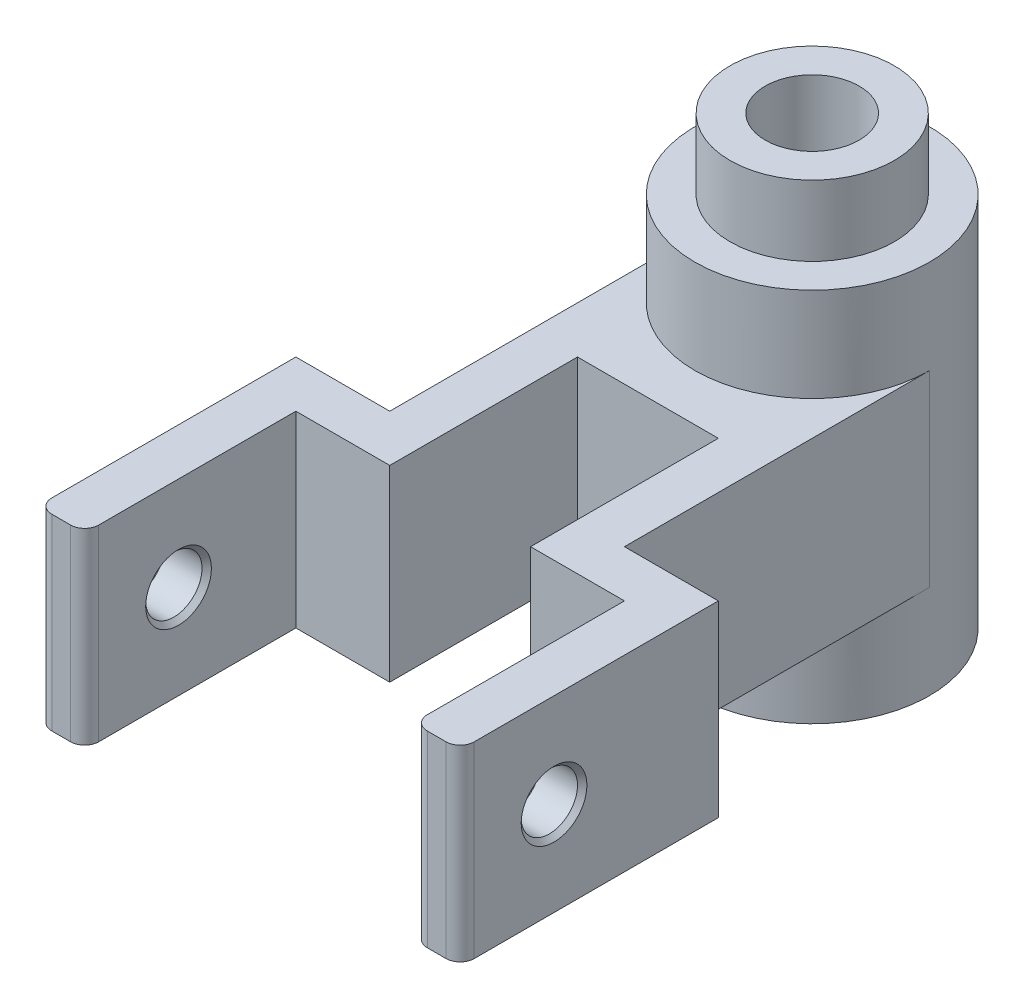
ISO-10303-21;
HEADER;
FILE_DESCRIPTION(('STEP AP214'),'2;1');
FILE_NAME('part.step','',(''),(''),'','','');
FILE_SCHEMA(('AUTOMOTIVE_DESIGN { 1 0 10303 214 1 1 1 1 }'));
ENDSEC;
DATA;
#1=APPLICATION_CONTEXT('core data for automotive mechanical design processes');
#2=APPLICATION_PROTOCOL_DEFINITION('international standard','automotive_design',2000,#1);
#3=PRODUCT_CONTEXT('',#1,'mechanical');
#4=PRODUCT('Part','Part','',(#3));
#5=PRODUCT_RELATED_PRODUCT_CATEGORY('part','',(#4));
#6=PRODUCT_DEFINITION_FORMATION('','',#4);
#7=PRODUCT_DEFINITION_CONTEXT('part definition',#1,'design');
#8=PRODUCT_DEFINITION('design','',#6,#7);
#9=PRODUCT_DEFINITION_SHAPE('','',#8);
#10=(LENGTH_UNIT() NAMED_UNIT(*) SI_UNIT(.MILLI.,.METRE.));
#11=(NAMED_UNIT(*) PLANE_ANGLE_UNIT() SI_UNIT($,.RADIAN.));
#12=(NAMED_UNIT(*) SI_UNIT($,.STERADIAN.) SOLID_ANGLE_UNIT());
#13=UNCERTAINTY_MEASURE_WITH_UNIT(LENGTH_MEASURE(1.E-05),#10,'distance_accuracy_value','');
#14=(GEOMETRIC_REPRESENTATION_CONTEXT(3) GLOBAL_UNCERTAINTY_ASSIGNED_CONTEXT((#13)) GLOBAL_UNIT_ASSIGNED_CONTEXT((#10,
#11,#12)) REPRESENTATION_CONTEXT('',''));
#15=CARTESIAN_POINT('',(0.,0.,0.));
#16=DIRECTION('',(0.,0.,1.));
#17=DIRECTION('',(1.,0.,0.));
#18=AXIS2_PLACEMENT_3D('',#15,#16,#17);
#19=CARTESIAN_POINT('',(35.,40.,-120.));
#20=DIRECTION('',(0.,1.,0.));
#21=DIRECTION('',(0.,0.,1.));
#22=AXIS2_PLACEMENT_3D('',#19,#20,#21);
#23=PLANE('',#22);
#24=CARTESIAN_POINT('',(35.,40.,-120.));
#25=DIRECTION('',(0.,1.,0.));
#26=DIRECTION('',(0.,0.,1.));
#27=AXIS2_PLACEMENT_3D('',#24,#25,#26);
#28=CIRCLE('',#27,25.);
#29=CARTESIAN_POINT('',(35.,40.,-95.));
#30=VERTEX_POINT('',#29);
#31=EDGE_CURVE('E402',#30,#30,#28,.T.);
#32=ORIENTED_EDGE('',*,*,#31,.T.);
#33=EDGE_LOOP('',(#32));
#34=FACE_BOUND('',#33,.T.);
#35=CARTESIAN_POINT('',(35.,40.,-120.));
#36=DIRECTION('',(0.,1.,0.));
#37=DIRECTION('',(0.,0.,1.));
#38=AXIS2_PLACEMENT_3D('',#35,#36,#37);
#39=CIRCLE('',#38,17.5);
#40=CARTESIAN_POINT('',(35.,40.,-102.5));
#41=VERTEX_POINT('',#40);
#42=EDGE_CURVE('E213',#41,#41,#39,.F.);
#43=ORIENTED_EDGE('',*,*,#42,.T.);
#44=EDGE_LOOP('',(#43));
#45=FACE_BOUND('',#44,.T.);
#46=ADVANCED_FACE('F35',(#34,#45),#23,.T.);
#47=CARTESIAN_POINT('',(0.,20.,0.));
#48=DIRECTION('',(0.,1.,0.));
#49=DIRECTION('',(0.,0.,1.));
#50=AXIS2_PLACEMENT_3D('',#47,#48,#49);
#51=PLANE('',#50);
#52=DIRECTION('',(0.,0.,-1.));
#53=VECTOR('',#52,1.);
#54=CARTESIAN_POINT('',(60.,20.,-55.));
#55=LINE('',#54,#53);
#56=CARTESIAN_POINT('',(60.,20.,-55.));
#57=VERTEX_POINT('',#56);
#58=CARTESIAN_POINT('',(60.,20.,-120.));
#59=VERTEX_POINT('',#58);
#60=EDGE_CURVE('E484',#57,#59,#55,.T.);
#61=ORIENTED_EDGE('',*,*,#60,.T.);
#62=CARTESIAN_POINT('',(35.,20.,-120.));
#63=DIRECTION('',(0.,1.,0.));
#64=DIRECTION('',(0.,0.,1.));
#65=AXIS2_PLACEMENT_3D('',#62,#63,#64);
#66=CIRCLE('',#65,25.);
#67=CARTESIAN_POINT('',(9.99999999999999,20.,-120.));
#68=VERTEX_POINT('',#67);
#69=EDGE_CURVE('E398',#59,#68,#66,.F.);
#70=ORIENTED_EDGE('',*,*,#69,.T.);
#71=DIRECTION('',(0.,0.,1.));
#72=VECTOR('',#71,1.);
#73=CARTESIAN_POINT('',(9.99999999999999,20.,-120.));
#74=LINE('',#73,#72);
#75=CARTESIAN_POINT('',(9.99999999999999,20.,-55.));
#76=VERTEX_POINT('',#75);
#77=EDGE_CURVE('E193',#68,#76,#74,.T.);
#78=ORIENTED_EDGE('',*,*,#77,.T.);
#79=DIRECTION('',(-1.,0.,0.));
#80=VECTOR('',#79,1.);
#81=CARTESIAN_POINT('',(9.99999999999999,20.,-55.));
#82=LINE('',#81,#80);
#83=CARTESIAN_POINT('',(-10.,20.,-55.));
#84=VERTEX_POINT('',#83);
#85=EDGE_CURVE('E486',#76,#84,#82,.T.);
#86=ORIENTED_EDGE('',*,*,#85,.T.);
#87=DIRECTION('',(0.,0.,1.));
#88=VECTOR('',#87,1.);
#89=CARTESIAN_POINT('',(-10.,20.,-55.));
#90=LINE('',#89,#88);
#91=CARTESIAN_POINT('',(-10.,20.,-3.));
#92=VERTEX_POINT('',#91);
#93=EDGE_CURVE('E405',#84,#92,#90,.T.);
#94=ORIENTED_EDGE('',*,*,#93,.T.);
#95=CARTESIAN_POINT('',(-7.,20.,-3.));
#96=DIRECTION('',(0.,1.,0.));
#97=DIRECTION('',(0.,0.,1.));
#98=AXIS2_PLACEMENT_3D('',#95,#96,#97);
#99=CIRCLE('',#98,3.);
#100=CARTESIAN_POINT('',(-7.,20.,0.));
#101=VERTEX_POINT('',#100);
#102=EDGE_CURVE('E467',#92,#101,#99,.T.);
#103=ORIENTED_EDGE('',*,*,#102,.T.);
#104=DIRECTION('',(1.,0.,0.));
#105=VECTOR('',#104,1.);
#106=CARTESIAN_POINT('',(-10.,20.,0.));
#107=LINE('',#106,#105);
#108=CARTESIAN_POINT('',(-3.,20.,0.));
#109=VERTEX_POINT('',#108);
#110=EDGE_CURVE('E392',#101,#109,#107,.T.);
#111=ORIENTED_EDGE('',*,*,#110,.T.);
#112=CARTESIAN_POINT('',(-3.,20.,-3.));
#113=DIRECTION('',(0.,1.,0.));
#114=DIRECTION('',(0.,0.,1.));
#115=AXIS2_PLACEMENT_3D('',#112,#113,#114);
#116=CIRCLE('',#115,3.);
#117=CARTESIAN_POINT('',(0.,20.,-3.));
#118=VERTEX_POINT('',#117);
#119=EDGE_CURVE('E465',#109,#118,#116,.T.);
#120=ORIENTED_EDGE('',*,*,#119,.T.);
#121=DIRECTION('',(0.,0.,-1.));
#122=VECTOR('',#121,1.);
#123=CARTESIAN_POINT('',(0.,20.,0.));
#124=LINE('',#123,#122);
#125=CARTESIAN_POINT('',(0.,20.,-45.));
#126=VERTEX_POINT('',#125);
#127=EDGE_CURVE('E491',#118,#126,#124,.T.);
#128=ORIENTED_EDGE('',*,*,#127,.T.);
#129=DIRECTION('',(1.,0.,0.));
#130=VECTOR('',#129,1.);
#131=CARTESIAN_POINT('',(0.,20.,-45.));
#132=LINE('',#131,#130);
#133=CARTESIAN_POINT('',(20.,20.,-45.));
#134=VERTEX_POINT('',#133);
#135=EDGE_CURVE('E505',#126,#134,#132,.T.);
#136=ORIENTED_EDGE('',*,*,#135,.T.);
#137=DIRECTION('',(0.,0.,-1.));
#138=VECTOR('',#137,1.);
#139=CARTESIAN_POINT('',(20.,20.,-45.));
#140=LINE('',#139,#138);
#141=CARTESIAN_POINT('',(20.,20.,-85.));
#142=VERTEX_POINT('',#141);
#143=EDGE_CURVE('E502',#134,#142,#140,.T.);
#144=ORIENTED_EDGE('',*,*,#143,.T.);
#145=DIRECTION('',(1.,0.,0.));
#146=VECTOR('',#145,1.);
#147=CARTESIAN_POINT('',(20.,20.,-85.));
#148=LINE('',#147,#146);
#149=CARTESIAN_POINT('',(50.,20.,-85.));
#150=VERTEX_POINT('',#149);
#151=EDGE_CURVE('E504',#142,#150,#148,.T.);
#152=ORIENTED_EDGE('',*,*,#151,.T.);
#153=DIRECTION('',(0.,0.,1.));
#154=VECTOR('',#153,1.);
#155=CARTESIAN_POINT('',(50.,20.,-85.));
#156=LINE('',#155,#154);
#157=CARTESIAN_POINT('',(50.,20.,-45.));
#158=VERTEX_POINT('',#157);
#159=EDGE_CURVE('E507',#150,#158,#156,.T.);
#160=ORIENTED_EDGE('',*,*,#159,.T.);
#161=DIRECTION('',(1.,0.,0.));
#162=VECTOR('',#161,1.);
#163=CARTESIAN_POINT('',(50.,20.,-45.));
#164=LINE('',#163,#162);
#165=CARTESIAN_POINT('',(70.,20.,-45.));
#166=VERTEX_POINT('',#165);
#167=EDGE_CURVE('E479',#158,#166,#164,.T.);
#168=ORIENTED_EDGE('',*,*,#167,.T.);
#169=DIRECTION('',(0.,0.,1.));
#170=VECTOR('',#169,1.);
#171=CARTESIAN_POINT('',(70.,20.,-45.));
#172=LINE('',#171,#170);
#173=CARTESIAN_POINT('',(70.,20.,-3.00000000000002));
#174=VERTEX_POINT('',#173);
#175=EDGE_CURVE('E472',#166,#174,#172,.T.);
#176=ORIENTED_EDGE('',*,*,#175,.T.);
#177=CARTESIAN_POINT('',(73.,20.,-3.));
#178=DIRECTION('',(0.,1.,0.));
#179=DIRECTION('',(0.,0.,1.));
#180=AXIS2_PLACEMENT_3D('',#177,#178,#179);
#181=CIRCLE('',#180,3.);
#182=CARTESIAN_POINT('',(73.,20.,0.));
#183=VERTEX_POINT('',#182);
#184=EDGE_CURVE('E375',#174,#183,#181,.T.);
#185=ORIENTED_EDGE('',*,*,#184,.T.);
#186=DIRECTION('',(1.,0.,0.));
#187=VECTOR('',#186,1.);
#188=CARTESIAN_POINT('',(70.,20.,0.));
#189=LINE('',#188,#187);
#190=CARTESIAN_POINT('',(77.,20.,0.));
#191=VERTEX_POINT('',#190);
#192=EDGE_CURVE('E470',#183,#191,#189,.T.);
#193=ORIENTED_EDGE('',*,*,#192,.T.);
#194=CARTESIAN_POINT('',(77.,20.,-3.));
#195=DIRECTION('',(0.,1.,0.));
#196=DIRECTION('',(0.,0.,1.));
#197=AXIS2_PLACEMENT_3D('',#194,#195,#196);
#198=CIRCLE('',#197,3.);
#199=CARTESIAN_POINT('',(80.,20.,-3.));
#200=VERTEX_POINT('',#199);
#201=EDGE_CURVE('E377',#191,#200,#198,.T.);
#202=ORIENTED_EDGE('',*,*,#201,.T.);
#203=DIRECTION('',(0.,0.,-1.));
#204=VECTOR('',#203,1.);
#205=CARTESIAN_POINT('',(80.,20.,0.));
#206=LINE('',#205,#204);
#207=CARTESIAN_POINT('',(80.,20.,-55.));
#208=VERTEX_POINT('',#207);
#209=EDGE_CURVE('E475',#200,#208,#206,.T.);
#210=ORIENTED_EDGE('',*,*,#209,.T.);
#211=DIRECTION('',(-1.,0.,0.));
#212=VECTOR('',#211,1.);
#213=CARTESIAN_POINT('',(80.,20.,-55.));
#214=LINE('',#213,#212);
#215=EDGE_CURVE('E477',#208,#57,#214,.T.);
#216=ORIENTED_EDGE('',*,*,#215,.T.);
#217=EDGE_LOOP('',(#61,#70,#78,#86,#94,#103,#111,#120,#128,#136,#144,#152,#160,#168,#176,#185,
#193,#202,#210,#216));
#218=FACE_BOUND('',#217,.T.);
#219=ADVANCED_FACE('F251',(#218),#51,.T.);
#220=CARTESIAN_POINT('',(0.,-20.,0.));
#221=DIRECTION('',(0.,1.,0.));
#222=DIRECTION('',(0.,0.,1.));
#223=AXIS2_PLACEMENT_3D('',#220,#221,#222);
#224=PLANE('',#223);
#225=CARTESIAN_POINT('',(35.,-20.,-120.));
#226=DIRECTION('',(0.,1.,0.));
#227=DIRECTION('',(0.,0.,1.));
#228=AXIS2_PLACEMENT_3D('',#225,#226,#227);
#229=CIRCLE('',#228,25.);
#230=CARTESIAN_POINT('',(60.,-20.,-120.));
#231=VERTEX_POINT('',#230);
#232=CARTESIAN_POINT('',(9.99999999999999,-20.,-120.));
#233=VERTEX_POINT('',#232);
#234=EDGE_CURVE('E180',#231,#233,#229,.F.);
#235=ORIENTED_EDGE('',*,*,#234,.F.);
#236=DIRECTION('',(0.,0.,-1.));
#237=VECTOR('',#236,1.);
#238=CARTESIAN_POINT('',(60.,-20.,-55.));
#239=LINE('',#238,#237);
#240=CARTESIAN_POINT('',(60.,-20.,-55.));
#241=VERTEX_POINT('',#240);
#242=EDGE_CURVE('E187',#241,#231,#239,.T.);
#243=ORIENTED_EDGE('',*,*,#242,.F.);
#244=DIRECTION('',(-1.,0.,0.));
#245=VECTOR('',#244,1.);
#246=CARTESIAN_POINT('',(80.,-20.,-55.));
#247=LINE('',#246,#245);
#248=CARTESIAN_POINT('',(80.,-20.,-55.));
#249=VERTEX_POINT('',#248);
#250=EDGE_CURVE('E420',#249,#241,#247,.T.);
#251=ORIENTED_EDGE('',*,*,#250,.F.);
#252=DIRECTION('',(0.,0.,-1.));
#253=VECTOR('',#252,1.);
#254=CARTESIAN_POINT('',(80.,-20.,0.));
#255=LINE('',#254,#253);
#256=CARTESIAN_POINT('',(80.,-20.,-3.));
#257=VERTEX_POINT('',#256);
#258=EDGE_CURVE('E418',#257,#249,#255,.T.);
#259=ORIENTED_EDGE('',*,*,#258,.F.);
#260=CARTESIAN_POINT('',(77.,-20.,-3.));
#261=DIRECTION('',(0.,1.,0.));
#262=DIRECTION('',(0.,0.,1.));
#263=AXIS2_PLACEMENT_3D('',#260,#261,#262);
#264=CIRCLE('',#263,3.);
#265=CARTESIAN_POINT('',(77.,-20.,0.));
#266=VERTEX_POINT('',#265);
#267=EDGE_CURVE('E459',#257,#266,#264,.F.);
#268=ORIENTED_EDGE('',*,*,#267,.T.);
#269=DIRECTION('',(1.,0.,0.));
#270=VECTOR('',#269,1.);
#271=CARTESIAN_POINT('',(70.,-20.,0.));
#272=LINE('',#271,#270);
#273=CARTESIAN_POINT('',(73.,-20.,0.));
#274=VERTEX_POINT('',#273);
#275=EDGE_CURVE('E368',#274,#266,#272,.T.);
#276=ORIENTED_EDGE('',*,*,#275,.F.);
#277=CARTESIAN_POINT('',(73.,-20.,-3.));
#278=DIRECTION('',(0.,1.,0.));
#279=DIRECTION('',(0.,0.,1.));
#280=AXIS2_PLACEMENT_3D('',#277,#278,#279);
#281=CIRCLE('',#280,3.);
#282=CARTESIAN_POINT('',(70.,-20.,-3.00000000000002));
#283=VERTEX_POINT('',#282);
#284=EDGE_CURVE('E373',#274,#283,#281,.F.);
#285=ORIENTED_EDGE('',*,*,#284,.T.);
#286=DIRECTION('',(0.,0.,1.));
#287=VECTOR('',#286,1.);
#288=CARTESIAN_POINT('',(70.,-20.,-45.));
#289=LINE('',#288,#287);
#290=CARTESIAN_POINT('',(70.,-20.,-45.));
#291=VERTEX_POINT('',#290);
#292=EDGE_CURVE('E364',#291,#283,#289,.T.);
#293=ORIENTED_EDGE('',*,*,#292,.F.);
#294=DIRECTION('',(1.,0.,0.));
#295=VECTOR('',#294,1.);
#296=CARTESIAN_POINT('',(50.,-20.,-45.));
#297=LINE('',#296,#295);
#298=CARTESIAN_POINT('',(50.,-20.,-45.));
#299=VERTEX_POINT('',#298);
#300=EDGE_CURVE('E369',#299,#291,#297,.T.);
#301=ORIENTED_EDGE('',*,*,#300,.F.);
#302=DIRECTION('',(0.,0.,1.));
#303=VECTOR('',#302,1.);
#304=CARTESIAN_POINT('',(50.,-20.,-85.));
#305=LINE('',#304,#303);
#306=CARTESIAN_POINT('',(50.,-20.,-85.));
#307=VERTEX_POINT('',#306);
#308=EDGE_CURVE('E413',#307,#299,#305,.T.);
#309=ORIENTED_EDGE('',*,*,#308,.F.);
#310=DIRECTION('',(1.,0.,0.));
#311=VECTOR('',#310,1.);
#312=CARTESIAN_POINT('',(20.,-20.,-85.));
#313=LINE('',#312,#311);
#314=CARTESIAN_POINT('',(20.,-20.,-85.));
#315=VERTEX_POINT('',#314);
#316=EDGE_CURVE('E411',#315,#307,#313,.T.);
#317=ORIENTED_EDGE('',*,*,#316,.F.);
#318=DIRECTION('',(0.,0.,-1.));
#319=VECTOR('',#318,1.);
#320=CARTESIAN_POINT('',(20.,-20.,-45.));
#321=LINE('',#320,#319);
#322=CARTESIAN_POINT('',(20.,-20.,-45.));
#323=VERTEX_POINT('',#322);
#324=EDGE_CURVE('E409',#323,#315,#321,.T.);
#325=ORIENTED_EDGE('',*,*,#324,.F.);
#326=DIRECTION('',(1.,0.,0.));
#327=VECTOR('',#326,1.);
#328=CARTESIAN_POINT('',(0.,-20.,-45.));
#329=LINE('',#328,#327);
#330=CARTESIAN_POINT('',(0.,-20.,-45.));
#331=VERTEX_POINT('',#330);
#332=EDGE_CURVE('E400',#331,#323,#329,.T.);
#333=ORIENTED_EDGE('',*,*,#332,.F.);
#334=DIRECTION('',(0.,0.,-1.));
#335=VECTOR('',#334,1.);
#336=CARTESIAN_POINT('',(0.,-20.,0.));
#337=LINE('',#336,#335);
#338=CARTESIAN_POINT('',(0.,-20.,-3.));
#339=VERTEX_POINT('',#338);
#340=EDGE_CURVE('E397',#339,#331,#337,.T.);
#341=ORIENTED_EDGE('',*,*,#340,.F.);
#342=CARTESIAN_POINT('',(-3.,-20.,-3.));
#343=DIRECTION('',(0.,1.,0.));
#344=DIRECTION('',(0.,0.,1.));
#345=AXIS2_PLACEMENT_3D('',#342,#343,#344);
#346=CIRCLE('',#345,3.);
#347=CARTESIAN_POINT('',(-3.,-20.,0.));
#348=VERTEX_POINT('',#347);
#349=EDGE_CURVE('E396',#339,#348,#346,.F.);
#350=ORIENTED_EDGE('',*,*,#349,.T.);
#351=DIRECTION('',(1.,0.,0.));
#352=VECTOR('',#351,1.);
#353=CARTESIAN_POINT('',(-10.,-20.,0.));
#354=LINE('',#353,#352);
#355=CARTESIAN_POINT('',(-7.,-20.,0.));
#356=VERTEX_POINT('',#355);
#357=EDGE_CURVE('E389',#356,#348,#354,.T.);
#358=ORIENTED_EDGE('',*,*,#357,.F.);
#359=CARTESIAN_POINT('',(-7.,-20.,-3.));
#360=DIRECTION('',(0.,1.,0.));
#361=DIRECTION('',(0.,0.,1.));
#362=AXIS2_PLACEMENT_3D('',#359,#360,#361);
#363=CIRCLE('',#362,3.);
#364=CARTESIAN_POINT('',(-10.,-20.,-3.));
#365=VERTEX_POINT('',#364);
#366=EDGE_CURVE('E394',#356,#365,#363,.F.);
#367=ORIENTED_EDGE('',*,*,#366,.T.);
#368=DIRECTION('',(0.,0.,1.));
#369=VECTOR('',#368,1.);
#370=CARTESIAN_POINT('',(-10.,-20.,-55.));
#371=LINE('',#370,#369);
#372=CARTESIAN_POINT('',(-10.,-20.,-55.));
#373=VERTEX_POINT('',#372);
#374=EDGE_CURVE('E424',#373,#365,#371,.T.);
#375=ORIENTED_EDGE('',*,*,#374,.F.);
#376=DIRECTION('',(-1.,0.,0.));
#377=VECTOR('',#376,1.);
#378=CARTESIAN_POINT('',(9.99999999999999,-20.,-55.));
#379=LINE('',#378,#377);
#380=CARTESIAN_POINT('',(9.99999999999999,-20.,-55.));
#381=VERTEX_POINT('',#380);
#382=EDGE_CURVE('E183',#381,#373,#379,.T.);
#383=ORIENTED_EDGE('',*,*,#382,.F.);
#384=DIRECTION('',(0.,0.,1.));
#385=VECTOR('',#384,1.);
#386=CARTESIAN_POINT('',(9.99999999999999,-20.,-120.));
#387=LINE('',#386,#385);
#388=EDGE_CURVE('E175',#233,#381,#387,.T.);
#389=ORIENTED_EDGE('',*,*,#388,.F.);
#390=EDGE_LOOP('',(#235,#243,#251,#259,#268,#276,#285,#293,#301,#309,#317,#325,#333,#341,#350,
#358,#367,#375,#383,#389));
#391=FACE_BOUND('',#390,.T.);
#392=ADVANCED_FACE('F177',(#391),#224,.F.);
#393=CARTESIAN_POINT('',(-10.,20.,0.));
#394=DIRECTION('',(0.,0.,-1.));
#395=DIRECTION('',(-1.,0.,0.));
#396=AXIS2_PLACEMENT_3D('',#393,#394,#395);
#397=PLANE('',#396);
#398=ORIENTED_EDGE('',*,*,#110,.F.);
#399=DIRECTION('',(0.,-1.,0.));
#400=VECTOR('',#399,1.);
#401=CARTESIAN_POINT('',(-7.,20.,0.));
#402=LINE('',#401,#400);
#403=EDGE_CURVE('E379',#101,#356,#402,.T.);
#404=ORIENTED_EDGE('',*,*,#403,.T.);
#405=ORIENTED_EDGE('',*,*,#357,.T.);
#406=DIRECTION('',(0.,-1.,0.));
#407=VECTOR('',#406,1.);
#408=CARTESIAN_POINT('',(-3.,20.,0.));
#409=LINE('',#408,#407);
#410=EDGE_CURVE('E376',#348,#109,#409,.F.);
#411=ORIENTED_EDGE('',*,*,#410,.T.);
#412=EDGE_LOOP('',(#398,#404,#405,#411));
#413=FACE_BOUND('',#412,.T.);
#414=ADVANCED_FACE('F279',(#413),#397,.F.);
#415=CARTESIAN_POINT('',(0.,20.,0.));
#416=DIRECTION('',(-1.,0.,0.));
#417=DIRECTION('',(0.,0.,1.));
#418=AXIS2_PLACEMENT_3D('',#415,#416,#417);
#419=PLANE('',#418);
#420=CARTESIAN_POINT('',(0.,0.,-20.));
#421=DIRECTION('',(-1.,0.,0.));
#422=DIRECTION('',(0.,0.,1.));
#423=AXIS2_PLACEMENT_3D('',#420,#421,#422);
#424=CIRCLE('',#423,6.99999999999992);
#425=CARTESIAN_POINT('',(0.,0.,-13.0000000000001));
#426=VERTEX_POINT('',#425);
#427=EDGE_CURVE('E43',#426,#426,#424,.T.);
#428=ORIENTED_EDGE('',*,*,#427,.T.);
#429=EDGE_LOOP('',(#428));
#430=FACE_BOUND('',#429,.T.);
#431=ORIENTED_EDGE('',*,*,#127,.F.);
#432=DIRECTION('',(0.,-1.,0.));
#433=VECTOR('',#432,1.);
#434=CARTESIAN_POINT('',(0.,20.,-3.));
#435=LINE('',#434,#433);
#436=EDGE_CURVE('E204',#118,#339,#435,.T.);
#437=ORIENTED_EDGE('',*,*,#436,.T.);
#438=ORIENTED_EDGE('',*,*,#340,.T.);
#439=DIRECTION('',(0.,-1.,0.));
#440=VECTOR('',#439,1.);
#441=CARTESIAN_POINT('',(0.,20.,-45.));
#442=LINE('',#441,#440);
#443=EDGE_CURVE('E450',#126,#331,#442,.T.);
#444=ORIENTED_EDGE('',*,*,#443,.F.);
#445=EDGE_LOOP('',(#431,#437,#438,#444));
#446=FACE_BOUND('',#445,.T.);
#447=ADVANCED_FACE('F234',(#430,#446),#419,.F.);
#448=CARTESIAN_POINT('',(0.,20.,-45.));
#449=DIRECTION('',(0.,0.,-1.));
#450=DIRECTION('',(-1.,0.,0.));
#451=AXIS2_PLACEMENT_3D('',#448,#449,#450);
#452=PLANE('',#451);
#453=ORIENTED_EDGE('',*,*,#332,.T.);
#454=DIRECTION('',(0.,-1.,0.));
#455=VECTOR('',#454,1.);
#456=CARTESIAN_POINT('',(20.,20.,-45.));
#457=LINE('',#456,#455);
#458=EDGE_CURVE('E447',#134,#323,#457,.T.);
#459=ORIENTED_EDGE('',*,*,#458,.F.);
#460=ORIENTED_EDGE('',*,*,#135,.F.);
#461=ORIENTED_EDGE('',*,*,#443,.T.);
#462=EDGE_LOOP('',(#453,#459,#460,#461));
#463=FACE_BOUND('',#462,.T.);
#464=ADVANCED_FACE('F326',(#463),#452,.F.);
#465=CARTESIAN_POINT('',(20.,20.,-45.));
#466=DIRECTION('',(-1.,0.,0.));
#467=DIRECTION('',(0.,0.,1.));
#468=AXIS2_PLACEMENT_3D('',#465,#466,#467);
#469=PLANE('',#468);
#470=ORIENTED_EDGE('',*,*,#324,.T.);
#471=DIRECTION('',(0.,-1.,0.));
#472=VECTOR('',#471,1.);
#473=CARTESIAN_POINT('',(20.,20.,-85.));
#474=LINE('',#473,#472);
#475=EDGE_CURVE('E444',#142,#315,#474,.T.);
#476=ORIENTED_EDGE('',*,*,#475,.F.);
#477=ORIENTED_EDGE('',*,*,#143,.F.);
#478=ORIENTED_EDGE('',*,*,#458,.T.);
#479=EDGE_LOOP('',(#470,#476,#477,#478));
#480=FACE_BOUND('',#479,.T.);
#481=ADVANCED_FACE('F322',(#480),#469,.F.);
#482=CARTESIAN_POINT('',(20.,20.,-85.));
#483=DIRECTION('',(0.,0.,-1.));
#484=DIRECTION('',(-1.,0.,0.));
#485=AXIS2_PLACEMENT_3D('',#482,#483,#484);
#486=PLANE('',#485);
#487=ORIENTED_EDGE('',*,*,#316,.T.);
#488=DIRECTION('',(0.,-1.,0.));
#489=VECTOR('',#488,1.);
#490=CARTESIAN_POINT('',(50.,20.,-85.));
#491=LINE('',#490,#489);
#492=EDGE_CURVE('E441',#150,#307,#491,.T.);
#493=ORIENTED_EDGE('',*,*,#492,.F.);
#494=ORIENTED_EDGE('',*,*,#151,.F.);
#495=ORIENTED_EDGE('',*,*,#475,.T.);
#496=EDGE_LOOP('',(#487,#493,#494,#495));
#497=FACE_BOUND('',#496,.T.);
#498=ADVANCED_FACE('F318',(#497),#486,.F.);
#499=CARTESIAN_POINT('',(50.,20.,-85.));
#500=DIRECTION('',(1.,0.,0.));
#501=DIRECTION('',(0.,0.,-1.));
#502=AXIS2_PLACEMENT_3D('',#499,#500,#501);
#503=PLANE('',#502);
#504=ORIENTED_EDGE('',*,*,#308,.T.);
#505=DIRECTION('',(0.,-1.,0.));
#506=VECTOR('',#505,1.);
#507=CARTESIAN_POINT('',(50.,20.,-45.));
#508=LINE('',#507,#506);
#509=EDGE_CURVE('E438',#158,#299,#508,.T.);
#510=ORIENTED_EDGE('',*,*,#509,.F.);
#511=ORIENTED_EDGE('',*,*,#159,.F.);
#512=ORIENTED_EDGE('',*,*,#492,.T.);
#513=EDGE_LOOP('',(#504,#510,#511,#512));
#514=FACE_BOUND('',#513,.T.);
#515=ADVANCED_FACE('F314',(#514),#503,.F.);
#516=CARTESIAN_POINT('',(50.,20.,-45.));
#517=DIRECTION('',(0.,0.,-1.));
#518=DIRECTION('',(-1.,0.,0.));
#519=AXIS2_PLACEMENT_3D('',#516,#517,#518);
#520=PLANE('',#519);
#521=ORIENTED_EDGE('',*,*,#300,.T.);
#522=DIRECTION('',(0.,-1.,0.));
#523=VECTOR('',#522,1.);
#524=CARTESIAN_POINT('',(70.,20.,-45.));
#525=LINE('',#524,#523);
#526=EDGE_CURVE('E366',#166,#291,#525,.T.);
#527=ORIENTED_EDGE('',*,*,#526,.F.);
#528=ORIENTED_EDGE('',*,*,#167,.F.);
#529=ORIENTED_EDGE('',*,*,#509,.T.);
#530=EDGE_LOOP('',(#521,#527,#528,#529));
#531=FACE_BOUND('',#530,.T.);
#532=ADVANCED_FACE('F310',(#531),#520,.F.);
#533=CARTESIAN_POINT('',(70.,20.,-45.));
#534=DIRECTION('',(1.,0.,0.));
#535=DIRECTION('',(0.,0.,-1.));
#536=AXIS2_PLACEMENT_3D('',#533,#534,#535);
#537=PLANE('',#536);
#538=CARTESIAN_POINT('',(70.,0.,-20.));
#539=DIRECTION('',(1.,0.,0.));
#540=DIRECTION('',(0.,0.,-1.));
#541=AXIS2_PLACEMENT_3D('',#538,#539,#540);
#542=CIRCLE('',#541,6.99999999999992);
#543=CARTESIAN_POINT('',(70.,0.,-26.9999999999999));
#544=VERTEX_POINT('',#543);
#545=EDGE_CURVE('E203',#544,#544,#542,.T.);
#546=ORIENTED_EDGE('',*,*,#545,.T.);
#547=EDGE_LOOP('',(#546));
#548=FACE_BOUND('',#547,.T.);
#549=ORIENTED_EDGE('',*,*,#292,.T.);
#550=DIRECTION('',(0.,-1.,0.));
#551=VECTOR('',#550,1.);
#552=CARTESIAN_POINT('',(70.,20.,-3.));
#553=LINE('',#552,#551);
#554=EDGE_CURVE('E58',#283,#174,#553,.F.);
#555=ORIENTED_EDGE('',*,*,#554,.T.);
#556=ORIENTED_EDGE('',*,*,#175,.F.);
#557=ORIENTED_EDGE('',*,*,#526,.T.);
#558=EDGE_LOOP('',(#549,#555,#556,#557));
#559=FACE_BOUND('',#558,.T.);
#560=ADVANCED_FACE('F306',(#548,#559),#537,.F.);
#561=CARTESIAN_POINT('',(70.,20.,0.));
#562=DIRECTION('',(0.,0.,-1.));
#563=DIRECTION('',(-1.,0.,0.));
#564=AXIS2_PLACEMENT_3D('',#561,#562,#563);
#565=PLANE('',#564);
#566=ORIENTED_EDGE('',*,*,#275,.T.);
#567=DIRECTION('',(0.,-1.,0.));
#568=VECTOR('',#567,1.);
#569=CARTESIAN_POINT('',(77.,20.,0.));
#570=LINE('',#569,#568);
#571=EDGE_CURVE('E463',#266,#191,#570,.F.);
#572=ORIENTED_EDGE('',*,*,#571,.T.);
#573=ORIENTED_EDGE('',*,*,#192,.F.);
#574=DIRECTION('',(0.,-1.,0.));
#575=VECTOR('',#574,1.);
#576=CARTESIAN_POINT('',(73.,20.,0.));
#577=LINE('',#576,#575);
#578=EDGE_CURVE('E461',#183,#274,#577,.T.);
#579=ORIENTED_EDGE('',*,*,#578,.T.);
#580=EDGE_LOOP('',(#566,#572,#573,#579));
#581=FACE_BOUND('',#580,.T.);
#582=ADVANCED_FACE('F302',(#581),#565,.F.);
#583=CARTESIAN_POINT('',(80.,20.,0.));
#584=DIRECTION('',(-1.,0.,0.));
#585=DIRECTION('',(0.,0.,1.));
#586=AXIS2_PLACEMENT_3D('',#583,#584,#585);
#587=PLANE('',#586);
#588=CARTESIAN_POINT('',(80.,0.,-20.));
#589=DIRECTION('',(-1.,0.,0.));
#590=DIRECTION('',(0.,0.,1.));
#591=AXIS2_PLACEMENT_3D('',#588,#589,#590);
#592=CIRCLE('',#591,7.00000000000014);
#593=CARTESIAN_POINT('',(80.,0.,-12.9999999999998));
#594=VERTEX_POINT('',#593);
#595=EDGE_CURVE('E11',#594,#594,#592,.T.);
#596=ORIENTED_EDGE('',*,*,#595,.T.);
#597=EDGE_LOOP('',(#596));
#598=FACE_BOUND('',#597,.T.);
#599=ORIENTED_EDGE('',*,*,#209,.F.);
#600=DIRECTION('',(0.,-1.,0.));
#601=VECTOR('',#600,1.);
#602=CARTESIAN_POINT('',(80.,20.,-3.));
#603=LINE('',#602,#601);
#604=EDGE_CURVE('E453',#200,#257,#603,.T.);
#605=ORIENTED_EDGE('',*,*,#604,.T.);
#606=ORIENTED_EDGE('',*,*,#258,.T.);
#607=DIRECTION('',(0.,-1.,0.));
#608=VECTOR('',#607,1.);
#609=CARTESIAN_POINT('',(80.,20.,-55.));
#610=LINE('',#609,#608);
#611=EDGE_CURVE('E434',#208,#249,#610,.T.);
#612=ORIENTED_EDGE('',*,*,#611,.F.);
#613=EDGE_LOOP('',(#599,#605,#606,#612));
#614=FACE_BOUND('',#613,.T.);
#615=ADVANCED_FACE('F298',(#598,#614),#587,.F.);
#616=CARTESIAN_POINT('',(80.,20.,-55.));
#617=DIRECTION('',(0.,0.,1.));
#618=DIRECTION('',(1.,0.,0.));
#619=AXIS2_PLACEMENT_3D('',#616,#617,#618);
#620=PLANE('',#619);
#621=ORIENTED_EDGE('',*,*,#250,.T.);
#622=DIRECTION('',(0.,-1.,0.));
#623=VECTOR('',#622,1.);
#624=CARTESIAN_POINT('',(60.,20.,-55.));
#625=LINE('',#624,#623);
#626=EDGE_CURVE('E431',#57,#241,#625,.T.);
#627=ORIENTED_EDGE('',*,*,#626,.F.);
#628=ORIENTED_EDGE('',*,*,#215,.F.);
#629=ORIENTED_EDGE('',*,*,#611,.T.);
#630=EDGE_LOOP('',(#621,#627,#628,#629));
#631=FACE_BOUND('',#630,.T.);
#632=ADVANCED_FACE('F294',(#631),#620,.F.);
#633=CARTESIAN_POINT('',(60.,20.,-55.));
#634=DIRECTION('',(-1.,0.,0.));
#635=DIRECTION('',(0.,0.,1.));
#636=AXIS2_PLACEMENT_3D('',#633,#634,#635);
#637=PLANE('',#636);
#638=ORIENTED_EDGE('',*,*,#242,.T.);
#639=DIRECTION('',(0.,-1.,0.));
#640=VECTOR('',#639,1.);
#641=CARTESIAN_POINT('',(60.,20.,-120.));
#642=LINE('',#641,#640);
#643=EDGE_CURVE('E196',#59,#231,#642,.T.);
#644=ORIENTED_EDGE('',*,*,#643,.F.);
#645=ORIENTED_EDGE('',*,*,#60,.F.);
#646=ORIENTED_EDGE('',*,*,#626,.T.);
#647=EDGE_LOOP('',(#638,#644,#645,#646));
#648=FACE_BOUND('',#647,.T.);
#649=ADVANCED_FACE('F291',(#648),#637,.F.);
#650=CARTESIAN_POINT('',(9.99999999999999,20.,-120.));
#651=DIRECTION('',(1.,0.,0.));
#652=DIRECTION('',(0.,0.,-1.));
#653=AXIS2_PLACEMENT_3D('',#650,#651,#652);
#654=PLANE('',#653);
#655=ORIENTED_EDGE('',*,*,#388,.T.);
#656=DIRECTION('',(0.,-1.,0.));
#657=VECTOR('',#656,1.);
#658=CARTESIAN_POINT('',(9.99999999999999,20.,-55.));
#659=LINE('',#658,#657);
#660=EDGE_CURVE('E197',#76,#381,#659,.T.);
#661=ORIENTED_EDGE('',*,*,#660,.F.);
#662=ORIENTED_EDGE('',*,*,#77,.F.);
#663=DIRECTION('',(0.,-1.,0.));
#664=VECTOR('',#663,1.);
#665=CARTESIAN_POINT('',(9.99999999999999,20.,-120.));
#666=LINE('',#665,#664);
#667=EDGE_CURVE('E191',#68,#233,#666,.T.);
#668=ORIENTED_EDGE('',*,*,#667,.T.);
#669=EDGE_LOOP('',(#655,#661,#662,#668));
#670=FACE_BOUND('',#669,.T.);
#671=ADVANCED_FACE('F192',(#670),#654,.F.);
#672=CARTESIAN_POINT('',(9.99999999999999,20.,-55.));
#673=DIRECTION('',(0.,0.,1.));
#674=DIRECTION('',(1.,0.,0.));
#675=AXIS2_PLACEMENT_3D('',#672,#673,#674);
#676=PLANE('',#675);
#677=ORIENTED_EDGE('',*,*,#382,.T.);
#678=DIRECTION('',(0.,-1.,0.));
#679=VECTOR('',#678,1.);
#680=CARTESIAN_POINT('',(-10.,20.,-55.));
#681=LINE('',#680,#679);
#682=EDGE_CURVE('E426',#84,#373,#681,.T.);
#683=ORIENTED_EDGE('',*,*,#682,.F.);
#684=ORIENTED_EDGE('',*,*,#85,.F.);
#685=ORIENTED_EDGE('',*,*,#660,.T.);
#686=EDGE_LOOP('',(#677,#683,#684,#685));
#687=FACE_BOUND('',#686,.T.);
#688=ADVANCED_FACE('F284',(#687),#676,.F.);
#689=CARTESIAN_POINT('',(-10.,20.,-55.));
#690=DIRECTION('',(1.,0.,0.));
#691=DIRECTION('',(0.,0.,-1.));
#692=AXIS2_PLACEMENT_3D('',#689,#690,#691);
#693=PLANE('',#692);
#694=CARTESIAN_POINT('',(-10.,0.,-20.));
#695=DIRECTION('',(1.,0.,0.));
#696=DIRECTION('',(0.,0.,-1.));
#697=AXIS2_PLACEMENT_3D('',#694,#695,#696);
#698=CIRCLE('',#697,6.99999999999987);
#699=CARTESIAN_POINT('',(-10.,0.,-26.9999999999999));
#700=VERTEX_POINT('',#699);
#701=EDGE_CURVE('E223',#700,#700,#698,.T.);
#702=ORIENTED_EDGE('',*,*,#701,.T.);
#703=EDGE_LOOP('',(#702));
#704=FACE_BOUND('',#703,.T.);
#705=ORIENTED_EDGE('',*,*,#374,.T.);
#706=DIRECTION('',(0.,-1.,0.));
#707=VECTOR('',#706,1.);
#708=CARTESIAN_POINT('',(-10.,20.,-3.));
#709=LINE('',#708,#707);
#710=EDGE_CURVE('E50',#365,#92,#709,.F.);
#711=ORIENTED_EDGE('',*,*,#710,.T.);
#712=ORIENTED_EDGE('',*,*,#93,.F.);
#713=ORIENTED_EDGE('',*,*,#682,.T.);
#714=EDGE_LOOP('',(#705,#711,#712,#713));
#715=FACE_BOUND('',#714,.T.);
#716=ADVANCED_FACE('F280',(#704,#715),#693,.F.);
#717=CARTESIAN_POINT('',(77.,20.,-3.));
#718=DIRECTION('',(0.,-1.,0.));
#719=DIRECTION('',(0.,0.,-1.));
#720=AXIS2_PLACEMENT_3D('',#717,#718,#719);
#721=CYLINDRICAL_SURFACE('',#720,3.);
#722=ORIENTED_EDGE('',*,*,#201,.F.);
#723=ORIENTED_EDGE('',*,*,#571,.F.);
#724=ORIENTED_EDGE('',*,*,#267,.F.);
#725=ORIENTED_EDGE('',*,*,#604,.F.);
#726=EDGE_LOOP('',(#722,#723,#724,#725));
#727=FACE_BOUND('',#726,.T.);
#728=ADVANCED_FACE('F283',(#727),#721,.T.);
#729=CARTESIAN_POINT('',(73.,20.,-3.));
#730=DIRECTION('',(0.,-1.,0.));
#731=DIRECTION('',(0.,0.,-1.));
#732=AXIS2_PLACEMENT_3D('',#729,#730,#731);
#733=CYLINDRICAL_SURFACE('',#732,3.);
#734=ORIENTED_EDGE('',*,*,#184,.F.);
#735=ORIENTED_EDGE('',*,*,#554,.F.);
#736=ORIENTED_EDGE('',*,*,#284,.F.);
#737=ORIENTED_EDGE('',*,*,#578,.F.);
#738=EDGE_LOOP('',(#734,#735,#736,#737));
#739=FACE_BOUND('',#738,.T.);
#740=ADVANCED_FACE('F338',(#739),#733,.T.);
#741=CARTESIAN_POINT('',(-7.,20.,-3.));
#742=DIRECTION('',(0.,-1.,0.));
#743=DIRECTION('',(0.,0.,-1.));
#744=AXIS2_PLACEMENT_3D('',#741,#742,#743);
#745=CYLINDRICAL_SURFACE('',#744,3.);
#746=ORIENTED_EDGE('',*,*,#102,.F.);
#747=ORIENTED_EDGE('',*,*,#710,.F.);
#748=ORIENTED_EDGE('',*,*,#366,.F.);
#749=ORIENTED_EDGE('',*,*,#403,.F.);
#750=EDGE_LOOP('',(#746,#747,#748,#749));
#751=FACE_BOUND('',#750,.T.);
#752=ADVANCED_FACE('F342',(#751),#745,.T.);
#753=CARTESIAN_POINT('',(-3.,20.,-3.));
#754=DIRECTION('',(0.,-1.,0.));
#755=DIRECTION('',(0.,0.,-1.));
#756=AXIS2_PLACEMENT_3D('',#753,#754,#755);
#757=CYLINDRICAL_SURFACE('',#756,3.);
#758=ORIENTED_EDGE('',*,*,#119,.F.);
#759=ORIENTED_EDGE('',*,*,#410,.F.);
#760=ORIENTED_EDGE('',*,*,#349,.F.);
#761=ORIENTED_EDGE('',*,*,#436,.F.);
#762=EDGE_LOOP('',(#758,#759,#760,#761));
#763=FACE_BOUND('',#762,.T.);
#764=ADVANCED_FACE('F274',(#763),#757,.T.);
#765=CARTESIAN_POINT('',(-10.,0.,-20.));
#766=DIRECTION('',(1.,0.,0.));
#767=DIRECTION('',(0.,0.,-1.));
#768=AXIS2_PLACEMENT_3D('',#765,#766,#767);
#769=CYLINDRICAL_SURFACE('',#768,6.);
#770=CARTESIAN_POINT('',(-9.00000000000013,0.,-20.));
#771=DIRECTION('',(1.,0.,0.));
#772=DIRECTION('',(0.,0.,-1.));
#773=AXIS2_PLACEMENT_3D('',#770,#771,#772);
#774=CIRCLE('',#773,6.);
#775=CARTESIAN_POINT('',(-9.00000000000013,0.,-26.));
#776=VERTEX_POINT('',#775);
#777=EDGE_CURVE('E229',#776,#776,#774,.F.);
#778=CARTESIAN_POINT('',(-0.999999999999902,0.,-20.));
#779=DIRECTION('',(-1.,0.,0.));
#780=DIRECTION('',(0.,0.,1.));
#781=AXIS2_PLACEMENT_3D('',#778,#779,#780);
#782=CIRCLE('',#781,6.);
#783=CARTESIAN_POINT('',(-0.999999999999902,0.,-26.));
#784=VERTEX_POINT('',#783);
#785=EDGE_CURVE('E226',#784,#784,#782,.F.);
#786=CARTESIAN_POINT('',(-9.00000000000013,0.,-26.));
#787=CARTESIAN_POINT('',(-8.91666666666679,0.,-26.));
#788=CARTESIAN_POINT('',(-8.83333333333346,0.,-26.));
#789=CARTESIAN_POINT('',(-8.66666666666679,0.,-26.));
#790=CARTESIAN_POINT('',(-8.58333333333345,0.,-26.));
#791=CARTESIAN_POINT('',(-8.41666666666678,0.,-26.));
#792=CARTESIAN_POINT('',(-8.33333333333344,0.,-26.));
#793=CARTESIAN_POINT('',(-8.16666666666677,0.,-26.));
#794=CARTESIAN_POINT('',(-8.08333333333344,0.,-26.));
#795=CARTESIAN_POINT('',(-7.91666666666676,0.,-26.));
#796=CARTESIAN_POINT('',(-7.83333333333343,0.,-26.));
#797=CARTESIAN_POINT('',(-7.66666666666676,0.,-26.));
#798=CARTESIAN_POINT('',(-7.58333333333342,0.,-26.));
#799=CARTESIAN_POINT('',(-7.41666666666675,0.,-26.));
#800=CARTESIAN_POINT('',(-7.33333333333341,0.,-26.));
#801=CARTESIAN_POINT('',(-7.16666666666674,0.,-26.));
#802=CARTESIAN_POINT('',(-7.08333333333341,0.,-26.));
#803=CARTESIAN_POINT('',(-6.91666666666674,0.,-26.));
#804=CARTESIAN_POINT('',(-6.8333333333334,0.,-26.));
#805=CARTESIAN_POINT('',(-6.66666666666673,0.,-26.));
#806=CARTESIAN_POINT('',(-6.58333333333339,0.,-26.));
#807=CARTESIAN_POINT('',(-6.41666666666672,0.,-26.));
#808=CARTESIAN_POINT('',(-6.33333333333339,0.,-26.));
#809=CARTESIAN_POINT('',(-6.16666666666671,0.,-26.));
#810=CARTESIAN_POINT('',(-6.08333333333338,0.,-26.));
#811=CARTESIAN_POINT('',(-5.91666666666671,0.,-26.));
#812=CARTESIAN_POINT('',(-5.83333333333337,0.,-26.));
#813=CARTESIAN_POINT('',(-5.6666666666667,0.,-26.));
#814=CARTESIAN_POINT('',(-5.58333333333337,0.,-26.));
#815=CARTESIAN_POINT('',(-5.41666666666669,0.,-26.));
#816=CARTESIAN_POINT('',(-5.33333333333336,0.,-26.));
#817=CARTESIAN_POINT('',(-5.16666666666669,0.,-26.));
#818=CARTESIAN_POINT('',(-5.08333333333335,0.,-26.));
#819=CARTESIAN_POINT('',(-4.91666666666668,0.,-26.));
#820=CARTESIAN_POINT('',(-4.83333333333334,0.,-26.));
#821=CARTESIAN_POINT('',(-4.66666666666667,0.,-26.));
#822=CARTESIAN_POINT('',(-4.58333333333334,0.,-26.));
#823=CARTESIAN_POINT('',(-4.41666666666667,0.,-26.));
#824=CARTESIAN_POINT('',(-4.33333333333333,0.,-26.));
#825=CARTESIAN_POINT('',(-4.16666666666666,0.,-26.));
#826=CARTESIAN_POINT('',(-4.08333333333332,0.,-26.));
#827=CARTESIAN_POINT('',(-3.91666666666665,0.,-26.));
#828=CARTESIAN_POINT('',(-3.83333333333332,0.,-26.));
#829=CARTESIAN_POINT('',(-3.66666666666664,0.,-26.));
#830=CARTESIAN_POINT('',(-3.58333333333331,0.,-26.));
#831=CARTESIAN_POINT('',(-3.41666666666664,0.,-26.));
#832=CARTESIAN_POINT('',(-3.3333333333333,0.,-26.));
#833=CARTESIAN_POINT('',(-3.16666666666663,0.,-26.));
#834=CARTESIAN_POINT('',(-3.08333333333329,0.,-26.));
#835=CARTESIAN_POINT('',(-2.91666666666662,0.,-26.));
#836=CARTESIAN_POINT('',(-2.83333333333329,0.,-26.));
#837=CARTESIAN_POINT('',(-2.66666666666662,0.,-26.));
#838=CARTESIAN_POINT('',(-2.58333333333328,0.,-26.));
#839=CARTESIAN_POINT('',(-2.41666666666661,0.,-26.));
#840=CARTESIAN_POINT('',(-2.33333333333327,0.,-26.));
#841=CARTESIAN_POINT('',(-2.1666666666666,0.,-26.));
#842=CARTESIAN_POINT('',(-2.08333333333327,0.,-26.));
#843=CARTESIAN_POINT('',(-1.9166666666666,0.,-26.));
#844=CARTESIAN_POINT('',(-1.83333333333326,0.,-26.));
#845=CARTESIAN_POINT('',(-1.66666666666659,0.,-26.));
#846=CARTESIAN_POINT('',(-1.58333333333325,0.,-26.));
#847=CARTESIAN_POINT('',(-1.41666666666658,0.,-26.));
#848=CARTESIAN_POINT('',(-1.33333333333324,0.,-26.));
#849=CARTESIAN_POINT('',(-1.16666666666657,0.,-26.));
#850=CARTESIAN_POINT('',(-1.08333333333324,0.,-26.));
#851=CARTESIAN_POINT('',(-0.999999999999902,0.,-26.));
#852=B_SPLINE_CURVE_WITH_KNOTS('',3,(#786,#787,#788,#789,#790,#791,#792,#793,#794,#795,#796,
#797,#798,#799,#800,#801,#802,#803,#804,#805,#806,#807,#808,#809,#810,#811,#812,#813,#814,#815,
#816,#817,#818,#819,#820,#821,#822,#823,#824,#825,#826,#827,#828,#829,#830,#831,#832,#833,#834,
#835,#836,#837,#838,#839,#840,#841,#842,#843,#844,#845,#846,#847,#848,#849,#850,#851),
.UNSPECIFIED.,.F.,.F.,(4,2,2,2,2,2,2,2,2,2,2,2,2,2,2,2,2,2,2,2,2,2,2,2,2,2,2,2,2,2,2,2,4),(0.,
0.250000000000007,0.500000000000014,0.750000000000022,1.00000000000003,1.25000000000004,
1.50000000000004,1.75000000000005,2.00000000000006,2.25000000000006,2.50000000000007,
2.75000000000008,3.00000000000009,3.25000000000009,3.5000000000001,3.75000000000011,
4.00000000000011,4.25000000000012,4.50000000000013,4.75000000000013,5.00000000000014,
5.25000000000015,5.50000000000015,5.75000000000016,6.00000000000017,6.25000000000018,
6.50000000000018,6.75000000000019,7.0000000000002,7.2500000000002,7.50000000000021,
7.75000000000022,8.00000000000023),.UNSPECIFIED.);
#853=EDGE_CURVE('BSEAM272',#776,#784,#852,.T.);
#854=ORIENTED_EDGE('',*,*,#777,.T.);
#855=ORIENTED_EDGE('',*,*,#785,.T.);
#856=ORIENTED_EDGE('',*,*,#853,.T.);
#857=ORIENTED_EDGE('',*,*,#853,.F.);
#858=EDGE_LOOP('',(#854,#856,#855,#857));
#859=FACE_BOUND('',#858,.T.);
#860=ADVANCED_FACE('F272',(#859),#769,.F.);
#861=CARTESIAN_POINT('',(70.9999999999999,0.,-20.));
#862=DIRECTION('',(1.,0.,0.));
#863=DIRECTION('',(0.,0.,-1.));
#864=AXIS2_PLACEMENT_3D('',#861,#862,#863);
#865=CIRCLE('',#864,6.);
#866=CARTESIAN_POINT('',(70.9999999999999,0.,-26.));
#867=VERTEX_POINT('',#866);
#868=EDGE_CURVE('E220',#867,#867,#865,.F.);
#869=CARTESIAN_POINT('',(78.9999999999998,0.,-20.));
#870=DIRECTION('',(-1.,0.,0.));
#871=DIRECTION('',(0.,0.,1.));
#872=AXIS2_PLACEMENT_3D('',#869,#870,#871);
#873=CIRCLE('',#872,6.);
#874=CARTESIAN_POINT('',(78.9999999999999,0.,-26.));
#875=VERTEX_POINT('',#874);
#876=EDGE_CURVE('E207',#875,#875,#873,.F.);
#877=CARTESIAN_POINT('',(70.9999999999999,0.,-26.));
#878=CARTESIAN_POINT('',(71.0833333333332,0.,-26.));
#879=CARTESIAN_POINT('',(71.1666666666666,0.,-26.));
#880=CARTESIAN_POINT('',(71.3333333333332,0.,-26.));
#881=CARTESIAN_POINT('',(71.4166666666666,0.,-26.));
#882=CARTESIAN_POINT('',(71.5833333333332,0.,-26.));
#883=CARTESIAN_POINT('',(71.6666666666666,0.,-26.));
#884=CARTESIAN_POINT('',(71.8333333333332,0.,-26.));
#885=CARTESIAN_POINT('',(71.9166666666666,0.,-26.));
#886=CARTESIAN_POINT('',(72.0833333333332,0.,-26.));
#887=CARTESIAN_POINT('',(72.1666666666666,0.,-26.));
#888=CARTESIAN_POINT('',(72.3333333333332,0.,-26.));
#889=CARTESIAN_POINT('',(72.4166666666666,0.,-26.));
#890=CARTESIAN_POINT('',(72.5833333333332,0.,-26.));
#891=CARTESIAN_POINT('',(72.6666666666666,0.,-26.));
#892=CARTESIAN_POINT('',(72.8333333333332,0.,-26.));
#893=CARTESIAN_POINT('',(72.9166666666666,0.,-26.));
#894=CARTESIAN_POINT('',(73.0833333333332,0.,-26.));
#895=CARTESIAN_POINT('',(73.1666666666666,0.,-26.));
#896=CARTESIAN_POINT('',(73.3333333333332,0.,-26.));
#897=CARTESIAN_POINT('',(73.4166666666666,0.,-26.));
#898=CARTESIAN_POINT('',(73.5833333333332,0.,-26.));
#899=CARTESIAN_POINT('',(73.6666666666666,0.,-26.));
#900=CARTESIAN_POINT('',(73.8333333333332,0.,-26.));
#901=CARTESIAN_POINT('',(73.9166666666666,0.,-26.));
#902=CARTESIAN_POINT('',(74.0833333333332,0.,-26.));
#903=CARTESIAN_POINT('',(74.1666666666665,0.,-26.));
#904=CARTESIAN_POINT('',(74.3333333333332,0.,-26.));
#905=CARTESIAN_POINT('',(74.4166666666665,0.,-26.));
#906=CARTESIAN_POINT('',(74.5833333333332,0.,-26.));
#907=CARTESIAN_POINT('',(74.6666666666665,0.,-26.));
#908=CARTESIAN_POINT('',(74.8333333333332,0.,-26.));
#909=CARTESIAN_POINT('',(74.9166666666665,0.,-26.));
#910=CARTESIAN_POINT('',(75.0833333333332,0.,-26.));
#911=CARTESIAN_POINT('',(75.1666666666665,0.,-26.));
#912=CARTESIAN_POINT('',(75.3333333333332,0.,-26.));
#913=CARTESIAN_POINT('',(75.4166666666665,0.,-26.));
#914=CARTESIAN_POINT('',(75.5833333333332,0.,-26.));
#915=CARTESIAN_POINT('',(75.6666666666665,0.,-26.));
#916=CARTESIAN_POINT('',(75.8333333333332,0.,-26.));
#917=CARTESIAN_POINT('',(75.9166666666665,0.,-26.));
#918=CARTESIAN_POINT('',(76.0833333333332,0.,-26.));
#919=CARTESIAN_POINT('',(76.1666666666665,0.,-26.));
#920=CARTESIAN_POINT('',(76.3333333333332,0.,-26.));
#921=CARTESIAN_POINT('',(76.4166666666665,0.,-26.));
#922=CARTESIAN_POINT('',(76.5833333333332,0.,-26.));
#923=CARTESIAN_POINT('',(76.6666666666665,0.,-26.));
#924=CARTESIAN_POINT('',(76.8333333333332,0.,-26.));
#925=CARTESIAN_POINT('',(76.9166666666665,0.,-26.));
#926=CARTESIAN_POINT('',(77.0833333333332,0.,-26.));
#927=CARTESIAN_POINT('',(77.1666666666665,0.,-26.));
#928=CARTESIAN_POINT('',(77.3333333333332,0.,-26.));
#929=CARTESIAN_POINT('',(77.4166666666665,0.,-26.));
#930=CARTESIAN_POINT('',(77.5833333333332,0.,-26.));
#931=CARTESIAN_POINT('',(77.6666666666665,0.,-26.));
#932=CARTESIAN_POINT('',(77.8333333333332,0.,-26.));
#933=CARTESIAN_POINT('',(77.9166666666665,0.,-26.));
#934=CARTESIAN_POINT('',(78.0833333333332,0.,-26.));
#935=CARTESIAN_POINT('',(78.1666666666665,0.,-26.));
#936=CARTESIAN_POINT('',(78.3333333333332,0.,-26.));
#937=CARTESIAN_POINT('',(78.4166666666665,0.,-26.));
#938=CARTESIAN_POINT('',(78.5833333333332,0.,-26.));
#939=CARTESIAN_POINT('',(78.6666666666665,0.,-26.));
#940=CARTESIAN_POINT('',(78.8333333333332,0.,-26.));
#941=CARTESIAN_POINT('',(78.9166666666665,0.,-26.));
#942=CARTESIAN_POINT('',(78.9999999999999,0.,-26.));
#943=B_SPLINE_CURVE_WITH_KNOTS('',3,(#877,#878,#879,#880,#881,#882,#883,#884,#885,#886,#887,
#888,#889,#890,#891,#892,#893,#894,#895,#896,#897,#898,#899,#900,#901,#902,#903,#904,#905,#906,
#907,#908,#909,#910,#911,#912,#913,#914,#915,#916,#917,#918,#919,#920,#921,#922,#923,#924,#925,
#926,#927,#928,#929,#930,#931,#932,#933,#934,#935,#936,#937,#938,#939,#940,#941,#942),
.UNSPECIFIED.,.F.,.F.,(4,2,2,2,2,2,2,2,2,2,2,2,2,2,2,2,2,2,2,2,2,2,2,2,2,2,2,2,2,2,2,2,4),(0.,
0.25,0.5,0.750000000000001,1.,1.24999999999999,1.49999999999999,1.74999999999999,
1.99999999999999,2.24999999999999,2.49999999999999,2.74999999999999,2.99999999999998,
3.24999999999998,3.49999999999998,3.74999999999998,3.99999999999998,4.24999999999998,
4.49999999999998,4.74999999999998,4.99999999999998,5.24999999999996,5.49999999999996,
5.74999999999996,5.99999999999996,6.24999999999996,6.49999999999996,6.74999999999996,
6.99999999999995,7.24999999999995,7.49999999999995,7.74999999999995,7.99999999999995),.UNSPECIFIED.);
#944=EDGE_CURVE('BSEAM271',#867,#875,#943,.T.);
#945=ORIENTED_EDGE('',*,*,#868,.T.);
#946=ORIENTED_EDGE('',*,*,#876,.T.);
#947=ORIENTED_EDGE('',*,*,#944,.T.);
#948=ORIENTED_EDGE('',*,*,#944,.F.);
#949=EDGE_LOOP('',(#945,#947,#946,#948));
#950=FACE_BOUND('',#949,.T.);
#951=ADVANCED_FACE('F271',(#950),#769,.F.);
#952=CARTESIAN_POINT('',(35.,40.,-120.));
#953=DIRECTION('',(0.,-1.,0.));
#954=DIRECTION('',(0.,0.,-1.));
#955=AXIS2_PLACEMENT_3D('',#952,#953,#954);
#956=CYLINDRICAL_SURFACE('',#955,25.);
#957=ORIENTED_EDGE('',*,*,#69,.F.);
#958=ORIENTED_EDGE('',*,*,#643,.T.);
#959=ORIENTED_EDGE('',*,*,#234,.T.);
#960=ORIENTED_EDGE('',*,*,#667,.F.);
#961=EDGE_LOOP('',(#957,#958,#959,#960));
#962=FACE_BOUND('',#961,.T.);
#963=ORIENTED_EDGE('',*,*,#31,.F.);
#964=EDGE_LOOP('',(#963));
#965=FACE_BOUND('',#964,.T.);
#966=CARTESIAN_POINT('',(35.,-40.,-120.));
#967=DIRECTION('',(0.,1.,0.));
#968=DIRECTION('',(0.,0.,1.));
#969=AXIS2_PLACEMENT_3D('',#966,#967,#968);
#970=CIRCLE('',#969,25.);
#971=CARTESIAN_POINT('',(35.,-40.,-95.));
#972=VERTEX_POINT('',#971);
#973=EDGE_CURVE('E215',#972,#972,#970,.T.);
#974=ORIENTED_EDGE('',*,*,#973,.T.);
#975=EDGE_LOOP('',(#974));
#976=FACE_BOUND('',#975,.T.);
#977=ADVANCED_FACE('F200',(#962,#965,#976),#956,.T.);
#978=CARTESIAN_POINT('',(35.,-40.,-120.));
#979=DIRECTION('',(0.,1.,0.));
#980=DIRECTION('',(0.,0.,1.));
#981=AXIS2_PLACEMENT_3D('',#978,#979,#980);
#982=PLANE('',#981);
#983=CARTESIAN_POINT('',(35.,-40.,-120.));
#984=DIRECTION('',(0.,1.,0.));
#985=DIRECTION('',(0.,0.,1.));
#986=AXIS2_PLACEMENT_3D('',#983,#984,#985);
#987=CIRCLE('',#986,10.);
#988=CARTESIAN_POINT('',(35.,-40.,-110.));
#989=VERTEX_POINT('',#988);
#990=EDGE_CURVE('E523',#989,#989,#987,.T.);
#991=ORIENTED_EDGE('',*,*,#990,.T.);
#992=EDGE_LOOP('',(#991));
#993=FACE_BOUND('',#992,.T.);
#994=ORIENTED_EDGE('',*,*,#973,.F.);
#995=EDGE_LOOP('',(#994));
#996=FACE_BOUND('',#995,.T.);
#997=ADVANCED_FACE('F265',(#993,#996),#982,.F.);
#998=CARTESIAN_POINT('',(35.,55.,-120.));
#999=DIRECTION('',(0.,-1.,0.));
#1000=DIRECTION('',(0.,0.,-1.));
#1001=AXIS2_PLACEMENT_3D('',#998,#999,#1000);
#1002=CYLINDRICAL_SURFACE('',#1001,17.5);
#1003=ORIENTED_EDGE('',*,*,#42,.F.);
#1004=EDGE_LOOP('',(#1003));
#1005=FACE_BOUND('',#1004,.T.);
#1006=CARTESIAN_POINT('',(35.,55.,-120.));
#1007=DIRECTION('',(0.,1.,0.));
#1008=DIRECTION('',(0.,0.,1.));
#1009=AXIS2_PLACEMENT_3D('',#1006,#1007,#1008);
#1010=CIRCLE('',#1009,17.5);
#1011=CARTESIAN_POINT('',(35.,55.,-102.5));
#1012=VERTEX_POINT('',#1011);
#1013=EDGE_CURVE('E216',#1012,#1012,#1010,.T.);
#1014=ORIENTED_EDGE('',*,*,#1013,.F.);
#1015=EDGE_LOOP('',(#1014));
#1016=FACE_BOUND('',#1015,.T.);
#1017=ADVANCED_FACE('F263',(#1005,#1016),#1002,.T.);
#1018=CARTESIAN_POINT('',(35.,55.,-120.));
#1019=DIRECTION('',(0.,1.,0.));
#1020=DIRECTION('',(0.,0.,1.));
#1021=AXIS2_PLACEMENT_3D('',#1018,#1019,#1020);
#1022=PLANE('',#1021);
#1023=CARTESIAN_POINT('',(35.,55.,-120.));
#1024=DIRECTION('',(0.,1.,0.));
#1025=DIRECTION('',(0.,0.,1.));
#1026=AXIS2_PLACEMENT_3D('',#1023,#1024,#1025);
#1027=CIRCLE('',#1026,10.);
#1028=CARTESIAN_POINT('',(35.,55.,-110.));
#1029=VERTEX_POINT('',#1028);
#1030=EDGE_CURVE('E524',#1029,#1029,#1027,.T.);
#1031=ORIENTED_EDGE('',*,*,#1030,.F.);
#1032=EDGE_LOOP('',(#1031));
#1033=FACE_BOUND('',#1032,.T.);
#1034=ORIENTED_EDGE('',*,*,#1013,.T.);
#1035=EDGE_LOOP('',(#1034));
#1036=FACE_BOUND('',#1035,.T.);
#1037=ADVANCED_FACE('F356',(#1033,#1036),#1022,.T.);
#1038=CARTESIAN_POINT('',(35.,-40.,-120.));
#1039=DIRECTION('',(0.,1.,0.));
#1040=DIRECTION('',(0.,0.,1.));
#1041=AXIS2_PLACEMENT_3D('',#1038,#1039,#1040);
#1042=CYLINDRICAL_SURFACE('',#1041,10.);
#1043=ORIENTED_EDGE('',*,*,#990,.F.);
#1044=EDGE_LOOP('',(#1043));
#1045=FACE_BOUND('',#1044,.T.);
#1046=ORIENTED_EDGE('',*,*,#1030,.T.);
#1047=EDGE_LOOP('',(#1046));
#1048=FACE_BOUND('',#1047,.T.);
#1049=ADVANCED_FACE('F351',(#1045,#1048),#1042,.F.);
#1050=CARTESIAN_POINT('',(70.,0.,-20.));
#1051=DIRECTION('',(-1.,0.,0.));
#1052=DIRECTION('',(0.,0.,1.));
#1053=AXIS2_PLACEMENT_3D('',#1050,#1051,#1052);
#1054=CONICAL_SURFACE('',#1053,6.99999999999992,0.785398163397458);
#1055=ORIENTED_EDGE('',*,*,#868,.F.);
#1056=EDGE_LOOP('',(#1055));
#1057=FACE_BOUND('',#1056,.T.);
#1058=ORIENTED_EDGE('',*,*,#545,.F.);
#1059=EDGE_LOOP('',(#1058));
#1060=FACE_BOUND('',#1059,.T.);
#1061=ADVANCED_FACE('F246',(#1057,#1060),#1054,.F.);
#1062=CARTESIAN_POINT('',(-10.,0.,-20.));
#1063=DIRECTION('',(-1.,0.,0.));
#1064=DIRECTION('',(0.,0.,1.));
#1065=AXIS2_PLACEMENT_3D('',#1062,#1063,#1064);
#1066=CONICAL_SURFACE('',#1065,6.99999999999987,0.785398163397445);
#1067=ORIENTED_EDGE('',*,*,#777,.F.);
#1068=EDGE_LOOP('',(#1067));
#1069=FACE_BOUND('',#1068,.T.);
#1070=ORIENTED_EDGE('',*,*,#701,.F.);
#1071=EDGE_LOOP('',(#1070));
#1072=FACE_BOUND('',#1071,.T.);
#1073=ADVANCED_FACE('F239',(#1069,#1072),#1066,.F.);
#1074=CARTESIAN_POINT('',(0.,0.,-20.));
#1075=DIRECTION('',(1.,0.,0.));
#1076=DIRECTION('',(0.,0.,-1.));
#1077=AXIS2_PLACEMENT_3D('',#1074,#1075,#1076);
#1078=CONICAL_SURFACE('',#1077,6.99999999999992,0.78539816339746);
#1079=ORIENTED_EDGE('',*,*,#785,.F.);
#1080=EDGE_LOOP('',(#1079));
#1081=FACE_BOUND('',#1080,.T.);
#1082=ORIENTED_EDGE('',*,*,#427,.F.);
#1083=EDGE_LOOP('',(#1082));
#1084=FACE_BOUND('',#1083,.T.);
#1085=ADVANCED_FACE('F237',(#1081,#1084),#1078,.F.);
#1086=CARTESIAN_POINT('',(78.9999999999998,0.,-20.));
#1087=DIRECTION('',(1.,0.,0.));
#1088=DIRECTION('',(0.,0.,-1.));
#1089=AXIS2_PLACEMENT_3D('',#1086,#1087,#1088);
#1090=CONICAL_SURFACE('',#1089,6.,0.785398163397445);
#1091=ORIENTED_EDGE('',*,*,#595,.F.);
#1092=EDGE_LOOP('',(#1091));
#1093=FACE_BOUND('',#1092,.T.);
#1094=ORIENTED_EDGE('',*,*,#876,.F.);
#1095=EDGE_LOOP('',(#1094));
#1096=FACE_BOUND('',#1095,.T.);
#1097=ADVANCED_FACE('F37',(#1093,#1096),#1090,.F.);
#1098=CLOSED_SHELL('',(#46,#219,#392,#414,#447,#464,#481,#498,#515,#532,#560,#582,#615,#632,
#649,#671,#688,#716,#728,#740,#752,#764,#860,#951,#977,#997,#1017,#1037,#1049,#1061,#1073,#1085,#1097));
#1099=MANIFOLD_SOLID_BREP('B2',#1098);
#1100=ADVANCED_BREP_SHAPE_REPRESENTATION('',(#18,#1099),#14);
#1101=SHAPE_DEFINITION_REPRESENTATION(#9,#1100);
ENDSEC;
END-ISO-10303-21;
